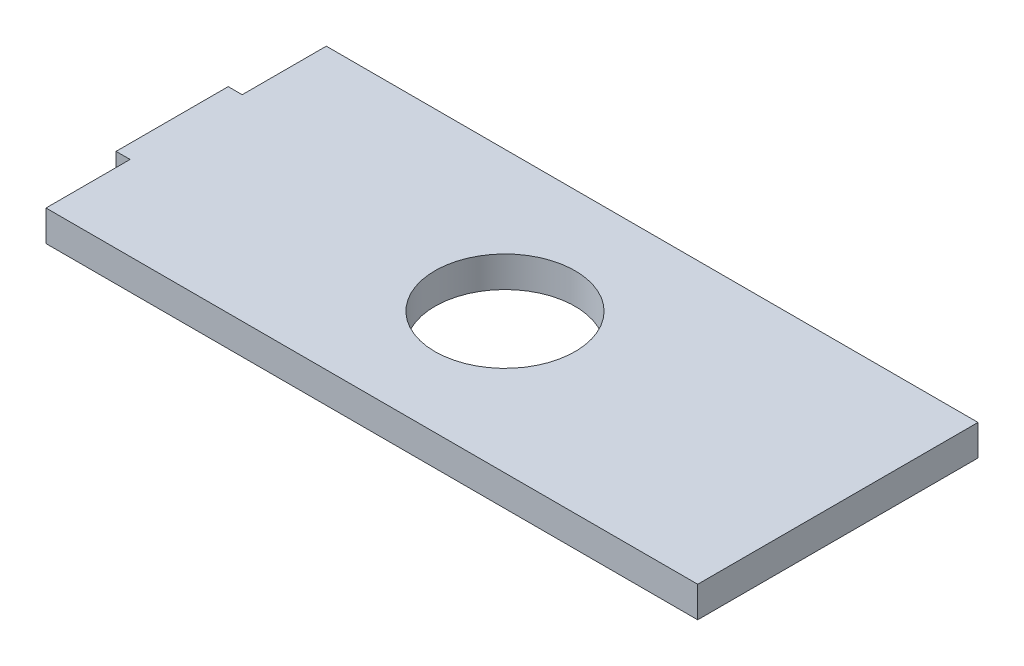
ISO-10303-21;
HEADER;
FILE_DESCRIPTION(('STEP AP214'),'2;1');
FILE_NAME('part.step','',(''),(''),'','','');
FILE_SCHEMA(('AUTOMOTIVE_DESIGN { 1 0 10303 214 1 1 1 1 }'));
ENDSEC;
DATA;
#1=APPLICATION_CONTEXT('core data for automotive mechanical design processes');
#2=APPLICATION_PROTOCOL_DEFINITION('international standard','automotive_design',2000,#1);
#3=PRODUCT_CONTEXT('',#1,'mechanical');
#4=PRODUCT('Part','Part','',(#3));
#5=PRODUCT_RELATED_PRODUCT_CATEGORY('part','',(#4));
#6=PRODUCT_DEFINITION_FORMATION('','',#4);
#7=PRODUCT_DEFINITION_CONTEXT('part definition',#1,'design');
#8=PRODUCT_DEFINITION('design','',#6,#7);
#9=PRODUCT_DEFINITION_SHAPE('','',#8);
#10=(LENGTH_UNIT() NAMED_UNIT(*) SI_UNIT(.MILLI.,.METRE.));
#11=(NAMED_UNIT(*) PLANE_ANGLE_UNIT() SI_UNIT($,.RADIAN.));
#12=(NAMED_UNIT(*) SI_UNIT($,.STERADIAN.) SOLID_ANGLE_UNIT());
#13=UNCERTAINTY_MEASURE_WITH_UNIT(LENGTH_MEASURE(1.E-05),#10,'distance_accuracy_value','');
#14=(GEOMETRIC_REPRESENTATION_CONTEXT(3) GLOBAL_UNCERTAINTY_ASSIGNED_CONTEXT((#13)) GLOBAL_UNIT_ASSIGNED_CONTEXT((#10,
#11,#12)) REPRESENTATION_CONTEXT('',''));
#15=CARTESIAN_POINT('',(0.,0.,0.));
#16=DIRECTION('',(0.,0.,1.));
#17=DIRECTION('',(1.,0.,0.));
#18=AXIS2_PLACEMENT_3D('',#15,#16,#17);
#19=CARTESIAN_POINT('',(0.,2.2,-36.5977127156591));
#20=DIRECTION('',(0.,0.,-1.));
#21=DIRECTION('',(-1.,0.,0.));
#22=AXIS2_PLACEMENT_3D('',#19,#20,#21);
#23=PLANE('',#22);
#24=DIRECTION('',(1.,0.,0.));
#25=VECTOR('',#24,1.);
#26=CARTESIAN_POINT('',(0.,0.,-36.5977127156591));
#27=LINE('',#26,#25);
#28=CARTESIAN_POINT('',(-89.4999999999604,0.,-36.5977127156591));
#29=VERTEX_POINT('',#28);
#30=CARTESIAN_POINT('',(-43.0000000000047,0.,-36.597712715666));
#31=VERTEX_POINT('',#30);
#32=EDGE_CURVE('E135',#29,#31,#27,.T.);
#33=ORIENTED_EDGE('',*,*,#32,.F.);
#34=DIRECTION('',(0.,-1.,0.));
#35=VECTOR('',#34,1.);
#36=CARTESIAN_POINT('',(-89.4999999999604,2.2,-36.5977127156591));
#37=LINE('',#36,#35);
#38=CARTESIAN_POINT('',(-89.4999999999604,2.2,-36.5977127156591));
#39=VERTEX_POINT('',#38);
#40=EDGE_CURVE('E11',#39,#29,#37,.T.);
#41=ORIENTED_EDGE('',*,*,#40,.F.);
#42=DIRECTION('',(1.,0.,0.));
#43=VECTOR('',#42,1.);
#44=CARTESIAN_POINT('',(0.,2.2,-36.5977127156591));
#45=LINE('',#44,#43);
#46=CARTESIAN_POINT('',(-43.0000000000047,2.2,-36.597712715666));
#47=VERTEX_POINT('',#46);
#48=EDGE_CURVE('E154',#39,#47,#45,.T.);
#49=ORIENTED_EDGE('',*,*,#48,.T.);
#50=DIRECTION('',(0.,-1.,0.));
#51=VECTOR('',#50,1.);
#52=CARTESIAN_POINT('',(-43.0000000000047,2.2,-36.597712715666));
#53=LINE('',#52,#51);
#54=EDGE_CURVE('E53',#47,#31,#53,.T.);
#55=ORIENTED_EDGE('',*,*,#54,.T.);
#56=EDGE_LOOP('',(#33,#41,#49,#55));
#57=FACE_BOUND('',#56,.T.);
#58=ADVANCED_FACE('F37',(#57),#23,.T.);
#59=CARTESIAN_POINT('',(-89.4999999999607,2.2,-8.28041339199232E-13));
#60=DIRECTION('',(1.,0.,0.));
#61=DIRECTION('',(0.,0.,-1.));
#62=AXIS2_PLACEMENT_3D('',#59,#60,#61);
#63=PLANE('',#62);
#64=DIRECTION('',(0.,0.,1.));
#65=VECTOR('',#64,1.);
#66=CARTESIAN_POINT('',(-89.4999999999607,0.,-8.28041339199232E-13));
#67=LINE('',#66,#65);
#68=CARTESIAN_POINT('',(-89.4999999999604,0.,-30.5977127156326));
#69=VERTEX_POINT('',#68);
#70=EDGE_CURVE('E137',#29,#69,#67,.T.);
#71=ORIENTED_EDGE('',*,*,#70,.T.);
#72=DIRECTION('',(0.,-1.,0.));
#73=VECTOR('',#72,1.);
#74=CARTESIAN_POINT('',(-89.4999999999604,2.2,-30.5977127156326));
#75=LINE('',#74,#73);
#76=CARTESIAN_POINT('',(-89.4999999999604,2.2,-30.5977127156326));
#77=VERTEX_POINT('',#76);
#78=EDGE_CURVE('E45',#77,#69,#75,.T.);
#79=ORIENTED_EDGE('',*,*,#78,.F.);
#80=DIRECTION('',(0.,0.,1.));
#81=VECTOR('',#80,1.);
#82=CARTESIAN_POINT('',(-89.4999999999607,2.2,-8.28041339199232E-13));
#83=LINE('',#82,#81);
#84=EDGE_CURVE('E188',#39,#77,#83,.T.);
#85=ORIENTED_EDGE('',*,*,#84,.F.);
#86=ORIENTED_EDGE('',*,*,#40,.T.);
#87=EDGE_LOOP('',(#71,#79,#85,#86));
#88=FACE_BOUND('',#87,.T.);
#89=ADVANCED_FACE('F202',(#88),#63,.F.);
#90=CARTESIAN_POINT('',(0.,2.2,-30.5977127156326));
#91=DIRECTION('',(0.,0.,1.));
#92=DIRECTION('',(1.,0.,0.));
#93=AXIS2_PLACEMENT_3D('',#90,#91,#92);
#94=PLANE('',#93);
#95=DIRECTION('',(-1.,0.,0.));
#96=VECTOR('',#95,1.);
#97=CARTESIAN_POINT('',(0.,0.,-30.5977127156326));
#98=LINE('',#97,#96);
#99=CARTESIAN_POINT('',(-90.4999999999605,0.,-30.5977127156326));
#100=VERTEX_POINT('',#99);
#101=EDGE_CURVE('E139',#69,#100,#98,.T.);
#102=ORIENTED_EDGE('',*,*,#101,.T.);
#103=DIRECTION('',(0.,-1.,0.));
#104=VECTOR('',#103,1.);
#105=CARTESIAN_POINT('',(-90.4999999999605,2.2,-30.5977127156326));
#106=LINE('',#105,#104);
#107=CARTESIAN_POINT('',(-90.4999999999605,2.2,-30.5977127156326));
#108=VERTEX_POINT('',#107);
#109=EDGE_CURVE('E161',#108,#100,#106,.T.);
#110=ORIENTED_EDGE('',*,*,#109,.F.);
#111=DIRECTION('',(-1.,0.,0.));
#112=VECTOR('',#111,1.);
#113=CARTESIAN_POINT('',(0.,2.2,-30.5977127156326));
#114=LINE('',#113,#112);
#115=EDGE_CURVE('E170',#77,#108,#114,.T.);
#116=ORIENTED_EDGE('',*,*,#115,.F.);
#117=ORIENTED_EDGE('',*,*,#78,.T.);
#118=EDGE_LOOP('',(#102,#110,#116,#117));
#119=FACE_BOUND('',#118,.T.);
#120=ADVANCED_FACE('F168',(#119),#94,.F.);
#121=CARTESIAN_POINT('',(-90.4999999999608,2.2,-1.00475183728534E-12));
#122=DIRECTION('',(1.,0.,0.));
#123=DIRECTION('',(0.,0.,-1.));
#124=AXIS2_PLACEMENT_3D('',#121,#122,#123);
#125=PLANE('',#124);
#126=DIRECTION('',(0.,0.,1.));
#127=VECTOR('',#126,1.);
#128=CARTESIAN_POINT('',(-90.4999999999608,0.,-1.00475183728534E-12));
#129=LINE('',#128,#127);
#130=CARTESIAN_POINT('',(-90.4999999999605,0.,-22.5977127156326));
#131=VERTEX_POINT('',#130);
#132=EDGE_CURVE('E141',#100,#131,#129,.T.);
#133=ORIENTED_EDGE('',*,*,#132,.T.);
#134=DIRECTION('',(0.,-1.,0.));
#135=VECTOR('',#134,1.);
#136=CARTESIAN_POINT('',(-90.4999999999605,2.2,-22.5977127156326));
#137=LINE('',#136,#135);
#138=CARTESIAN_POINT('',(-90.4999999999605,2.2,-22.5977127156326));
#139=VERTEX_POINT('',#138);
#140=EDGE_CURVE('E158',#139,#131,#137,.T.);
#141=ORIENTED_EDGE('',*,*,#140,.F.);
#142=DIRECTION('',(0.,0.,1.));
#143=VECTOR('',#142,1.);
#144=CARTESIAN_POINT('',(-90.4999999999608,2.2,-1.00475183728534E-12));
#145=LINE('',#144,#143);
#146=EDGE_CURVE('E184',#108,#139,#145,.T.);
#147=ORIENTED_EDGE('',*,*,#146,.F.);
#148=ORIENTED_EDGE('',*,*,#109,.T.);
#149=EDGE_LOOP('',(#133,#141,#147,#148));
#150=FACE_BOUND('',#149,.T.);
#151=ADVANCED_FACE('F180',(#150),#125,.F.);
#152=CARTESIAN_POINT('',(0.,2.2,-22.5977127156326));
#153=DIRECTION('',(0.,0.,-1.));
#154=DIRECTION('',(-1.,0.,0.));
#155=AXIS2_PLACEMENT_3D('',#152,#153,#154);
#156=PLANE('',#155);
#157=DIRECTION('',(1.,0.,0.));
#158=VECTOR('',#157,1.);
#159=CARTESIAN_POINT('',(0.,0.,-22.5977127156326));
#160=LINE('',#159,#158);
#161=CARTESIAN_POINT('',(-89.4999999999607,0.,-22.5977127156326));
#162=VERTEX_POINT('',#161);
#163=EDGE_CURVE('E143',#131,#162,#160,.T.);
#164=ORIENTED_EDGE('',*,*,#163,.T.);
#165=DIRECTION('',(0.,-1.,0.));
#166=VECTOR('',#165,1.);
#167=CARTESIAN_POINT('',(-89.4999999999607,2.2,-22.5977127156326));
#168=LINE('',#167,#166);
#169=CARTESIAN_POINT('',(-89.4999999999607,2.2,-22.5977127156326));
#170=VERTEX_POINT('',#169);
#171=EDGE_CURVE('E124',#170,#162,#168,.T.);
#172=ORIENTED_EDGE('',*,*,#171,.F.);
#173=DIRECTION('',(1.,0.,0.));
#174=VECTOR('',#173,1.);
#175=CARTESIAN_POINT('',(0.,2.2,-22.5977127156326));
#176=LINE('',#175,#174);
#177=EDGE_CURVE('E112',#139,#170,#176,.T.);
#178=ORIENTED_EDGE('',*,*,#177,.F.);
#179=ORIENTED_EDGE('',*,*,#140,.T.);
#180=EDGE_LOOP('',(#164,#172,#178,#179));
#181=FACE_BOUND('',#180,.T.);
#182=ADVANCED_FACE('F183',(#181),#156,.F.);
#183=CARTESIAN_POINT('',(-89.4999999999611,2.2,-1.6560826783985E-12));
#184=DIRECTION('',(1.,0.,0.));
#185=DIRECTION('',(0.,0.,-1.));
#186=AXIS2_PLACEMENT_3D('',#183,#184,#185);
#187=PLANE('',#186);
#188=DIRECTION('',(0.,0.,1.));
#189=VECTOR('',#188,1.);
#190=CARTESIAN_POINT('',(-89.4999999999611,0.,-1.6560826783985E-12));
#191=LINE('',#190,#189);
#192=CARTESIAN_POINT('',(-89.4999999999607,0.,-16.5977127156591));
#193=VERTEX_POINT('',#192);
#194=EDGE_CURVE('E121',#162,#193,#191,.T.);
#195=ORIENTED_EDGE('',*,*,#194,.T.);
#196=DIRECTION('',(0.,-1.,0.));
#197=VECTOR('',#196,1.);
#198=CARTESIAN_POINT('',(-89.4999999999607,2.2,-16.5977127156591));
#199=LINE('',#198,#197);
#200=CARTESIAN_POINT('',(-89.4999999999607,2.2,-16.5977127156591));
#201=VERTEX_POINT('',#200);
#202=EDGE_CURVE('E118',#201,#193,#199,.T.);
#203=ORIENTED_EDGE('',*,*,#202,.F.);
#204=DIRECTION('',(0.,0.,1.));
#205=VECTOR('',#204,1.);
#206=CARTESIAN_POINT('',(-89.4999999999611,2.2,-1.6560826783985E-12));
#207=LINE('',#206,#205);
#208=EDGE_CURVE('E103',#170,#201,#207,.T.);
#209=ORIENTED_EDGE('',*,*,#208,.F.);
#210=ORIENTED_EDGE('',*,*,#171,.T.);
#211=EDGE_LOOP('',(#195,#203,#209,#210));
#212=FACE_BOUND('',#211,.T.);
#213=ADVANCED_FACE('F119',(#212),#187,.F.);
#214=CARTESIAN_POINT('',(0.,2.2,-16.5977127156591));
#215=DIRECTION('',(0.,0.,1.));
#216=DIRECTION('',(1.,0.,0.));
#217=AXIS2_PLACEMENT_3D('',#214,#215,#216);
#218=PLANE('',#217);
#219=DIRECTION('',(-1.,0.,0.));
#220=VECTOR('',#219,1.);
#221=CARTESIAN_POINT('',(0.,0.,-16.5977127156591));
#222=LINE('',#221,#220);
#223=CARTESIAN_POINT('',(-43.0000000000048,0.,-16.597712715666));
#224=VERTEX_POINT('',#223);
#225=EDGE_CURVE('E146',#224,#193,#222,.T.);
#226=ORIENTED_EDGE('',*,*,#225,.F.);
#227=DIRECTION('',(0.,-1.,0.));
#228=VECTOR('',#227,1.);
#229=CARTESIAN_POINT('',(-43.0000000000048,2.2,-16.597712715666));
#230=LINE('',#229,#228);
#231=CARTESIAN_POINT('',(-43.0000000000048,2.2,-16.597712715666));
#232=VERTEX_POINT('',#231);
#233=EDGE_CURVE('E78',#232,#224,#230,.T.);
#234=ORIENTED_EDGE('',*,*,#233,.F.);
#235=DIRECTION('',(-1.,0.,0.));
#236=VECTOR('',#235,1.);
#237=CARTESIAN_POINT('',(0.,2.2,-16.5977127156591));
#238=LINE('',#237,#236);
#239=EDGE_CURVE('E110',#232,#201,#238,.T.);
#240=ORIENTED_EDGE('',*,*,#239,.T.);
#241=ORIENTED_EDGE('',*,*,#202,.T.);
#242=EDGE_LOOP('',(#226,#234,#240,#241));
#243=FACE_BOUND('',#242,.T.);
#244=ADVANCED_FACE('F126',(#243),#218,.T.);
#245=CARTESIAN_POINT('',(-43.0000000000049,2.2,-2.38697950294436E-13));
#246=DIRECTION('',(1.,0.,0.));
#247=DIRECTION('',(0.,0.,-1.));
#248=AXIS2_PLACEMENT_3D('',#245,#246,#247);
#249=PLANE('',#248);
#250=DIRECTION('',(0.,0.,1.));
#251=VECTOR('',#250,1.);
#252=CARTESIAN_POINT('',(-43.0000000000049,0.,-2.38697950294436E-13));
#253=LINE('',#252,#251);
#254=EDGE_CURVE('E148',#31,#224,#253,.T.);
#255=ORIENTED_EDGE('',*,*,#254,.F.);
#256=ORIENTED_EDGE('',*,*,#54,.F.);
#257=DIRECTION('',(0.,0.,1.));
#258=VECTOR('',#257,1.);
#259=CARTESIAN_POINT('',(-43.0000000000049,2.2,-2.38697950294436E-13));
#260=LINE('',#259,#258);
#261=EDGE_CURVE('E127',#47,#232,#260,.T.);
#262=ORIENTED_EDGE('',*,*,#261,.T.);
#263=ORIENTED_EDGE('',*,*,#233,.T.);
#264=EDGE_LOOP('',(#255,#256,#262,#263));
#265=FACE_BOUND('',#264,.T.);
#266=ADVANCED_FACE('F190',(#265),#249,.T.);
#267=CARTESIAN_POINT('',(-66.7499999999924,2.2,-26.5977127156629));
#268=DIRECTION('',(0.,-1.,0.));
#269=DIRECTION('',(0.,0.,-1.));
#270=AXIS2_PLACEMENT_3D('',#267,#268,#269);
#271=CYLINDRICAL_SURFACE('',#270,5.00000000000003);
#272=CARTESIAN_POINT('',(-66.7499999999924,2.2,-26.5977127156629));
#273=DIRECTION('',(0.,1.,0.));
#274=DIRECTION('',(0.,0.,1.));
#275=AXIS2_PLACEMENT_3D('',#272,#273,#274);
#276=CIRCLE('',#275,5.00000000000003);
#277=CARTESIAN_POINT('',(-66.7499999999924,2.2,-21.5977127156629));
#278=VERTEX_POINT('',#277);
#279=EDGE_CURVE('E129',#278,#278,#276,.F.);
#280=ORIENTED_EDGE('',*,*,#279,.F.);
#281=EDGE_LOOP('',(#280));
#282=FACE_BOUND('',#281,.T.);
#283=CARTESIAN_POINT('',(-66.7499999999924,0.,-26.5977127156629));
#284=DIRECTION('',(0.,1.,0.));
#285=DIRECTION('',(0.,0.,1.));
#286=AXIS2_PLACEMENT_3D('',#283,#284,#285);
#287=CIRCLE('',#286,5.00000000000003);
#288=CARTESIAN_POINT('',(-66.7499999999924,0.,-21.5977127156629));
#289=VERTEX_POINT('',#288);
#290=EDGE_CURVE('E151',#289,#289,#287,.F.);
#291=ORIENTED_EDGE('',*,*,#290,.T.);
#292=EDGE_LOOP('',(#291));
#293=FACE_BOUND('',#292,.T.);
#294=ADVANCED_FACE('F192',(#282,#293),#271,.F.);
#295=CARTESIAN_POINT('',(0.,2.2,0.));
#296=DIRECTION('',(0.,1.,0.));
#297=DIRECTION('',(0.,0.,1.));
#298=AXIS2_PLACEMENT_3D('',#295,#296,#297);
#299=PLANE('',#298);
#300=ORIENTED_EDGE('',*,*,#48,.F.);
#301=ORIENTED_EDGE('',*,*,#84,.T.);
#302=ORIENTED_EDGE('',*,*,#115,.T.);
#303=ORIENTED_EDGE('',*,*,#146,.T.);
#304=ORIENTED_EDGE('',*,*,#177,.T.);
#305=ORIENTED_EDGE('',*,*,#208,.T.);
#306=ORIENTED_EDGE('',*,*,#239,.F.);
#307=ORIENTED_EDGE('',*,*,#261,.F.);
#308=EDGE_LOOP('',(#300,#301,#302,#303,#304,#305,#306,#307));
#309=FACE_BOUND('',#308,.T.);
#310=ORIENTED_EDGE('',*,*,#279,.T.);
#311=EDGE_LOOP('',(#310));
#312=FACE_BOUND('',#311,.T.);
#313=ADVANCED_FACE('F106',(#309,#312),#299,.T.);
#314=CARTESIAN_POINT('',(0.,0.,0.));
#315=DIRECTION('',(0.,1.,0.));
#316=DIRECTION('',(0.,0.,1.));
#317=AXIS2_PLACEMENT_3D('',#314,#315,#316);
#318=PLANE('',#317);
#319=ORIENTED_EDGE('',*,*,#32,.T.);
#320=ORIENTED_EDGE('',*,*,#254,.T.);
#321=ORIENTED_EDGE('',*,*,#225,.T.);
#322=ORIENTED_EDGE('',*,*,#194,.F.);
#323=ORIENTED_EDGE('',*,*,#163,.F.);
#324=ORIENTED_EDGE('',*,*,#132,.F.);
#325=ORIENTED_EDGE('',*,*,#101,.F.);
#326=ORIENTED_EDGE('',*,*,#70,.F.);
#327=EDGE_LOOP('',(#319,#320,#321,#322,#323,#324,#325,#326));
#328=FACE_BOUND('',#327,.T.);
#329=ORIENTED_EDGE('',*,*,#290,.F.);
#330=EDGE_LOOP('',(#329));
#331=FACE_BOUND('',#330,.T.);
#332=ADVANCED_FACE('F175',(#328,#331),#318,.F.);
#333=CLOSED_SHELL('',(#58,#89,#120,#151,#182,#213,#244,#266,#294,#313,#332));
#334=MANIFOLD_SOLID_BREP('B2',#333);
#335=ADVANCED_BREP_SHAPE_REPRESENTATION('',(#18,#334),#14);
#336=SHAPE_DEFINITION_REPRESENTATION(#9,#335);
ENDSEC;
END-ISO-10303-21;
